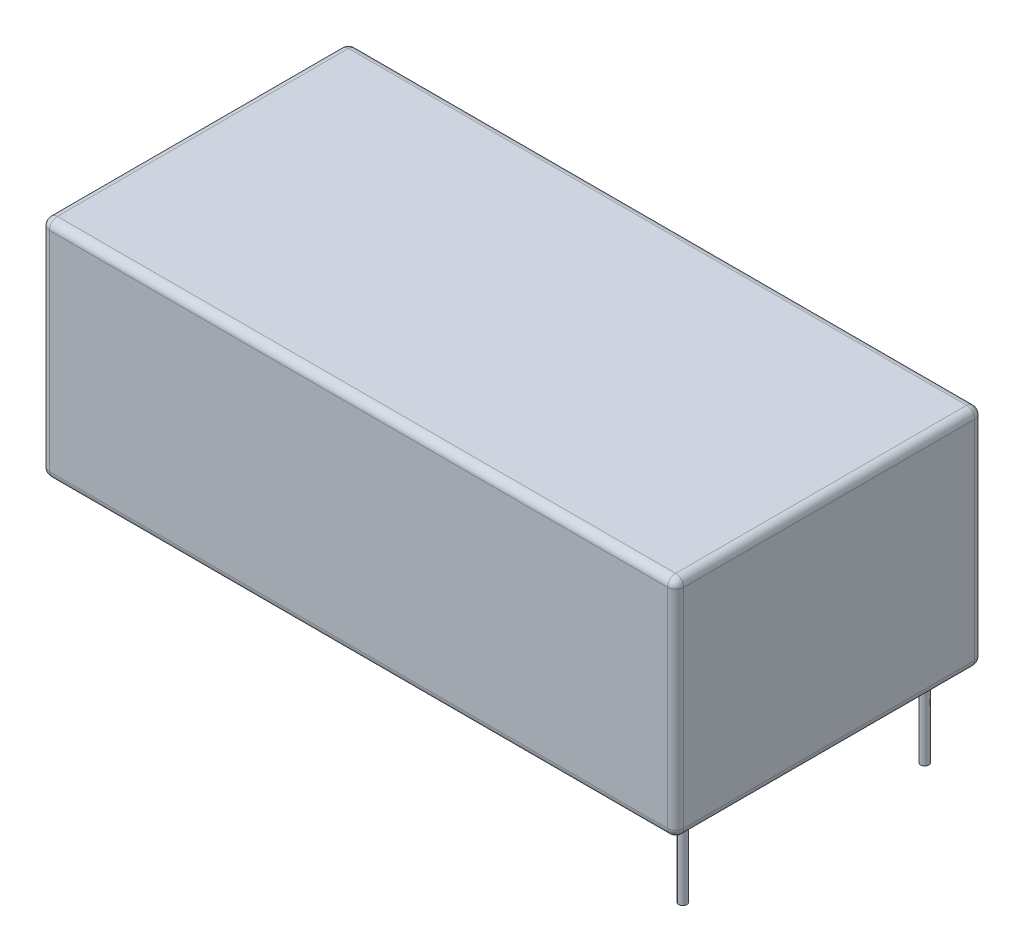
ISO-10303-21;
HEADER;
FILE_DESCRIPTION(('STEP AP214'),'2;1');
FILE_NAME('part.step','',(''),(''),'','','');
FILE_SCHEMA(('AUTOMOTIVE_DESIGN { 1 0 10303 214 1 1 1 1 }'));
ENDSEC;
DATA;
#1=APPLICATION_CONTEXT('core data for automotive mechanical design processes');
#2=APPLICATION_PROTOCOL_DEFINITION('international standard','automotive_design',2000,#1);
#3=PRODUCT_CONTEXT('',#1,'mechanical');
#4=PRODUCT('Part','Part','',(#3));
#5=PRODUCT_RELATED_PRODUCT_CATEGORY('part','',(#4));
#6=PRODUCT_DEFINITION_FORMATION('','',#4);
#7=PRODUCT_DEFINITION_CONTEXT('part definition',#1,'design');
#8=PRODUCT_DEFINITION('design','',#6,#7);
#9=PRODUCT_DEFINITION_SHAPE('','',#8);
#10=(LENGTH_UNIT() NAMED_UNIT(*) SI_UNIT(.MILLI.,.METRE.));
#11=(NAMED_UNIT(*) PLANE_ANGLE_UNIT() SI_UNIT($,.RADIAN.));
#12=(NAMED_UNIT(*) SI_UNIT($,.STERADIAN.) SOLID_ANGLE_UNIT());
#13=UNCERTAINTY_MEASURE_WITH_UNIT(LENGTH_MEASURE(1.E-05),#10,'distance_accuracy_value','');
#14=(GEOMETRIC_REPRESENTATION_CONTEXT(3) GLOBAL_UNCERTAINTY_ASSIGNED_CONTEXT((#13)) GLOBAL_UNIT_ASSIGNED_CONTEXT((#10,
#11,#12)) REPRESENTATION_CONTEXT('',''));
#15=CARTESIAN_POINT('',(0.,0.,0.));
#16=DIRECTION('',(0.,0.,1.));
#17=DIRECTION('',(1.,0.,0.));
#18=AXIS2_PLACEMENT_3D('',#15,#16,#17);
#19=CARTESIAN_POINT('',(0.,0.,38.1));
#20=DIRECTION('',(1.,0.,0.));
#21=DIRECTION('',(0.,0.,-1.));
#22=AXIS2_PLACEMENT_3D('',#19,#20,#21);
#23=PLANE('',#22);
#24=DIRECTION('',(0.,-1.,0.));
#25=VECTOR('',#24,1.);
#26=CARTESIAN_POINT('',(0.,0.,37.1));
#27=LINE('',#26,#25);
#28=CARTESIAN_POINT('',(0.,1.,37.1));
#29=VERTEX_POINT('',#28);
#30=CARTESIAN_POINT('',(0.,26.9,37.1));
#31=VERTEX_POINT('',#30);
#32=EDGE_CURVE('E42',#29,#31,#27,.F.);
#33=ORIENTED_EDGE('',*,*,#32,.T.);
#34=DIRECTION('',(0.,0.,-1.));
#35=VECTOR('',#34,1.);
#36=CARTESIAN_POINT('',(0.,26.9,38.1));
#37=LINE('',#36,#35);
#38=CARTESIAN_POINT('',(0.,26.9,1.));
#39=VERTEX_POINT('',#38);
#40=EDGE_CURVE('E11',#31,#39,#37,.T.);
#41=ORIENTED_EDGE('',*,*,#40,.T.);
#42=DIRECTION('',(0.,-1.,0.));
#43=VECTOR('',#42,1.);
#44=CARTESIAN_POINT('',(0.,0.,1.));
#45=LINE('',#44,#43);
#46=CARTESIAN_POINT('',(0.,1.,1.));
#47=VERTEX_POINT('',#46);
#48=EDGE_CURVE('E202',#39,#47,#45,.T.);
#49=ORIENTED_EDGE('',*,*,#48,.T.);
#50=DIRECTION('',(0.,0.,-1.));
#51=VECTOR('',#50,1.);
#52=CARTESIAN_POINT('',(0.,1.,38.1));
#53=LINE('',#52,#51);
#54=EDGE_CURVE('E53',#47,#29,#53,.F.);
#55=ORIENTED_EDGE('',*,*,#54,.T.);
#56=EDGE_LOOP('',(#33,#41,#49,#55));
#57=FACE_BOUND('',#56,.T.);
#58=ADVANCED_FACE('F33',(#57),#23,.F.);
#59=CARTESIAN_POINT('',(0.,0.,38.1));
#60=DIRECTION('',(0.,1.,0.));
#61=DIRECTION('',(0.,0.,1.));
#62=AXIS2_PLACEMENT_3D('',#59,#60,#61);
#63=PLANE('',#62);
#64=DIRECTION('',(0.,0.,-1.));
#65=VECTOR('',#64,1.);
#66=CARTESIAN_POINT('',(1.,0.,38.1));
#67=LINE('',#66,#65);
#68=CARTESIAN_POINT('',(1.,0.,37.1));
#69=VERTEX_POINT('',#68);
#70=CARTESIAN_POINT('',(1.,0.,1.));
#71=VERTEX_POINT('',#70);
#72=EDGE_CURVE('E126',#69,#71,#67,.T.);
#73=ORIENTED_EDGE('',*,*,#72,.T.);
#74=DIRECTION('',(1.,0.,0.));
#75=VECTOR('',#74,1.);
#76=CARTESIAN_POINT('',(78.7,0.,1.));
#77=LINE('',#76,#75);
#78=CARTESIAN_POINT('',(77.7,0.,1.));
#79=VERTEX_POINT('',#78);
#80=EDGE_CURVE('E165',#71,#79,#77,.T.);
#81=ORIENTED_EDGE('',*,*,#80,.T.);
#82=DIRECTION('',(0.,0.,-1.));
#83=VECTOR('',#82,1.);
#84=CARTESIAN_POINT('',(77.7,0.,38.1));
#85=LINE('',#84,#83);
#86=CARTESIAN_POINT('',(77.7,0.,37.1));
#87=VERTEX_POINT('',#86);
#88=EDGE_CURVE('E129',#79,#87,#85,.F.);
#89=ORIENTED_EDGE('',*,*,#88,.T.);
#90=DIRECTION('',(1.,0.,0.));
#91=VECTOR('',#90,1.);
#92=CARTESIAN_POINT('',(0.,0.,37.1));
#93=LINE('',#92,#91);
#94=EDGE_CURVE('E120',#87,#69,#93,.F.);
#95=ORIENTED_EDGE('',*,*,#94,.T.);
#96=EDGE_LOOP('',(#73,#81,#89,#95));
#97=FACE_BOUND('',#96,.T.);
#98=CARTESIAN_POINT('',(3.2,0.,19.1));
#99=DIRECTION('',(0.,1.,0.));
#100=DIRECTION('',(0.,0.,1.));
#101=AXIS2_PLACEMENT_3D('',#98,#99,#100);
#102=CIRCLE('',#101,0.5);
#103=CARTESIAN_POINT('',(3.2,0.,19.6));
#104=VERTEX_POINT('',#103);
#105=EDGE_CURVE('E157',#104,#104,#102,.F.);
#106=ORIENTED_EDGE('',*,*,#105,.F.);
#107=EDGE_LOOP('',(#106));
#108=FACE_BOUND('',#107,.T.);
#109=CARTESIAN_POINT('',(75.6,0.,34.1));
#110=DIRECTION('',(0.,1.,0.));
#111=DIRECTION('',(0.,0.,1.));
#112=AXIS2_PLACEMENT_3D('',#109,#110,#111);
#113=CIRCLE('',#112,0.499999999999999);
#114=CARTESIAN_POINT('',(75.6,0.,34.6));
#115=VERTEX_POINT('',#114);
#116=EDGE_CURVE('E160',#115,#115,#113,.F.);
#117=ORIENTED_EDGE('',*,*,#116,.F.);
#118=EDGE_LOOP('',(#117));
#119=FACE_BOUND('',#118,.T.);
#120=CARTESIAN_POINT('',(75.6,0.,4.10000000000001));
#121=DIRECTION('',(0.,1.,0.));
#122=DIRECTION('',(0.,0.,1.));
#123=AXIS2_PLACEMENT_3D('',#120,#121,#122);
#124=CIRCLE('',#123,0.499999999999999);
#125=CARTESIAN_POINT('',(75.6,0.,4.60000000000001));
#126=VERTEX_POINT('',#125);
#127=EDGE_CURVE('E281',#126,#126,#124,.F.);
#128=ORIENTED_EDGE('',*,*,#127,.F.);
#129=EDGE_LOOP('',(#128));
#130=FACE_BOUND('',#129,.T.);
#131=CARTESIAN_POINT('',(3.2,0.,4.1));
#132=DIRECTION('',(0.,1.,0.));
#133=DIRECTION('',(0.,0.,1.));
#134=AXIS2_PLACEMENT_3D('',#131,#132,#133);
#135=CIRCLE('',#134,0.500000000000001);
#136=CARTESIAN_POINT('',(3.2,0.,4.6));
#137=VERTEX_POINT('',#136);
#138=EDGE_CURVE('E278',#137,#137,#135,.F.);
#139=ORIENTED_EDGE('',*,*,#138,.F.);
#140=EDGE_LOOP('',(#139));
#141=FACE_BOUND('',#140,.T.);
#142=ADVANCED_FACE('F122',(#97,#108,#119,#130,#141),#63,.F.);
#143=CARTESIAN_POINT('',(78.7,0.,38.1));
#144=DIRECTION('',(-1.,0.,0.));
#145=DIRECTION('',(0.,0.,1.));
#146=AXIS2_PLACEMENT_3D('',#143,#144,#145);
#147=PLANE('',#146);
#148=DIRECTION('',(0.,0.,-1.));
#149=VECTOR('',#148,1.);
#150=CARTESIAN_POINT('',(78.7,1.,38.1));
#151=LINE('',#150,#149);
#152=CARTESIAN_POINT('',(78.7,1.,37.1));
#153=VERTEX_POINT('',#152);
#154=CARTESIAN_POINT('',(78.7,1.,1.));
#155=VERTEX_POINT('',#154);
#156=EDGE_CURVE('E189',#153,#155,#151,.T.);
#157=ORIENTED_EDGE('',*,*,#156,.T.);
#158=DIRECTION('',(0.,1.,0.));
#159=VECTOR('',#158,1.);
#160=CARTESIAN_POINT('',(78.7,27.9,1.));
#161=LINE('',#160,#159);
#162=CARTESIAN_POINT('',(78.7,26.9,1.));
#163=VERTEX_POINT('',#162);
#164=EDGE_CURVE('E192',#155,#163,#161,.T.);
#165=ORIENTED_EDGE('',*,*,#164,.T.);
#166=DIRECTION('',(0.,0.,-1.));
#167=VECTOR('',#166,1.);
#168=CARTESIAN_POINT('',(78.7,26.9,38.1));
#169=LINE('',#168,#167);
#170=CARTESIAN_POINT('',(78.7,26.9,37.1));
#171=VERTEX_POINT('',#170);
#172=EDGE_CURVE('E187',#163,#171,#169,.F.);
#173=ORIENTED_EDGE('',*,*,#172,.T.);
#174=DIRECTION('',(0.,1.,0.));
#175=VECTOR('',#174,1.);
#176=CARTESIAN_POINT('',(78.7,0.,37.1));
#177=LINE('',#176,#175);
#178=EDGE_CURVE('E185',#171,#153,#177,.F.);
#179=ORIENTED_EDGE('',*,*,#178,.T.);
#180=EDGE_LOOP('',(#157,#165,#173,#179));
#181=FACE_BOUND('',#180,.T.);
#182=ADVANCED_FACE('F290',(#181),#147,.F.);
#183=CARTESIAN_POINT('',(0.,27.9,38.1));
#184=DIRECTION('',(0.,-1.,0.));
#185=DIRECTION('',(0.,0.,-1.));
#186=AXIS2_PLACEMENT_3D('',#183,#184,#185);
#187=PLANE('',#186);
#188=DIRECTION('',(0.,0.,-1.));
#189=VECTOR('',#188,1.);
#190=CARTESIAN_POINT('',(77.7,27.9,38.1));
#191=LINE('',#190,#189);
#192=CARTESIAN_POINT('',(77.7,27.9,37.1));
#193=VERTEX_POINT('',#192);
#194=CARTESIAN_POINT('',(77.7,27.9,1.));
#195=VERTEX_POINT('',#194);
#196=EDGE_CURVE('E180',#193,#195,#191,.T.);
#197=ORIENTED_EDGE('',*,*,#196,.T.);
#198=DIRECTION('',(-1.,0.,0.));
#199=VECTOR('',#198,1.);
#200=CARTESIAN_POINT('',(0.,27.9,1.));
#201=LINE('',#200,#199);
#202=CARTESIAN_POINT('',(1.,27.9,1.));
#203=VERTEX_POINT('',#202);
#204=EDGE_CURVE('E182',#195,#203,#201,.T.);
#205=ORIENTED_EDGE('',*,*,#204,.T.);
#206=DIRECTION('',(0.,0.,-1.));
#207=VECTOR('',#206,1.);
#208=CARTESIAN_POINT('',(1.,27.9,38.1));
#209=LINE('',#208,#207);
#210=CARTESIAN_POINT('',(1.,27.9,37.1));
#211=VERTEX_POINT('',#210);
#212=EDGE_CURVE('E176',#203,#211,#209,.F.);
#213=ORIENTED_EDGE('',*,*,#212,.T.);
#214=DIRECTION('',(-1.,0.,0.));
#215=VECTOR('',#214,1.);
#216=CARTESIAN_POINT('',(0.,27.9,37.1));
#217=LINE('',#216,#215);
#218=EDGE_CURVE('E178',#211,#193,#217,.F.);
#219=ORIENTED_EDGE('',*,*,#218,.T.);
#220=EDGE_LOOP('',(#197,#205,#213,#219));
#221=FACE_BOUND('',#220,.T.);
#222=ADVANCED_FACE('F408',(#221),#187,.F.);
#223=CARTESIAN_POINT('',(0.,0.,38.1));
#224=DIRECTION('',(0.,0.,-1.));
#225=DIRECTION('',(-1.,0.,0.));
#226=AXIS2_PLACEMENT_3D('',#223,#224,#225);
#227=PLANE('',#226);
#228=DIRECTION('',(0.,1.,0.));
#229=VECTOR('',#228,1.);
#230=CARTESIAN_POINT('',(77.7,0.,38.1));
#231=LINE('',#230,#229);
#232=CARTESIAN_POINT('',(77.7,1.,38.1));
#233=VERTEX_POINT('',#232);
#234=CARTESIAN_POINT('',(77.7,26.9,38.1));
#235=VERTEX_POINT('',#234);
#236=EDGE_CURVE('E197',#233,#235,#231,.T.);
#237=ORIENTED_EDGE('',*,*,#236,.T.);
#238=DIRECTION('',(-1.,0.,0.));
#239=VECTOR('',#238,1.);
#240=CARTESIAN_POINT('',(0.,26.9,38.1));
#241=LINE('',#240,#239);
#242=CARTESIAN_POINT('',(1.,26.9,38.1));
#243=VERTEX_POINT('',#242);
#244=EDGE_CURVE('E199',#235,#243,#241,.T.);
#245=ORIENTED_EDGE('',*,*,#244,.T.);
#246=DIRECTION('',(0.,-1.,0.));
#247=VECTOR('',#246,1.);
#248=CARTESIAN_POINT('',(1.,0.,38.1));
#249=LINE('',#248,#247);
#250=CARTESIAN_POINT('',(1.,1.,38.1));
#251=VERTEX_POINT('',#250);
#252=EDGE_CURVE('E194',#243,#251,#249,.T.);
#253=ORIENTED_EDGE('',*,*,#252,.T.);
#254=DIRECTION('',(1.,0.,0.));
#255=VECTOR('',#254,1.);
#256=CARTESIAN_POINT('',(0.,1.,38.1));
#257=LINE('',#256,#255);
#258=EDGE_CURVE('E139',#251,#233,#257,.T.);
#259=ORIENTED_EDGE('',*,*,#258,.T.);
#260=EDGE_LOOP('',(#237,#245,#253,#259));
#261=FACE_BOUND('',#260,.T.);
#262=ADVANCED_FACE('F309',(#261),#227,.F.);
#263=CARTESIAN_POINT('',(0.,0.,0.));
#264=DIRECTION('',(0.,0.,-1.));
#265=DIRECTION('',(-1.,0.,0.));
#266=AXIS2_PLACEMENT_3D('',#263,#264,#265);
#267=PLANE('',#266);
#268=DIRECTION('',(-1.,0.,0.));
#269=VECTOR('',#268,1.);
#270=CARTESIAN_POINT('',(78.7,26.9,0.));
#271=LINE('',#270,#269);
#272=CARTESIAN_POINT('',(1.,26.9,0.));
#273=VERTEX_POINT('',#272);
#274=CARTESIAN_POINT('',(77.7,26.9,0.));
#275=VERTEX_POINT('',#274);
#276=EDGE_CURVE('E169',#273,#275,#271,.F.);
#277=ORIENTED_EDGE('',*,*,#276,.T.);
#278=DIRECTION('',(0.,1.,0.));
#279=VECTOR('',#278,1.);
#280=CARTESIAN_POINT('',(77.7,0.,0.));
#281=LINE('',#280,#279);
#282=CARTESIAN_POINT('',(77.7,1.,0.));
#283=VERTEX_POINT('',#282);
#284=EDGE_CURVE('E174',#275,#283,#281,.F.);
#285=ORIENTED_EDGE('',*,*,#284,.T.);
#286=DIRECTION('',(1.,0.,0.));
#287=VECTOR('',#286,1.);
#288=CARTESIAN_POINT('',(0.,1.,0.));
#289=LINE('',#288,#287);
#290=CARTESIAN_POINT('',(1.,1.,0.));
#291=VERTEX_POINT('',#290);
#292=EDGE_CURVE('E171',#283,#291,#289,.F.);
#293=ORIENTED_EDGE('',*,*,#292,.T.);
#294=DIRECTION('',(0.,-1.,0.));
#295=VECTOR('',#294,1.);
#296=CARTESIAN_POINT('',(1.,27.9,0.));
#297=LINE('',#296,#295);
#298=EDGE_CURVE('E167',#291,#273,#297,.F.);
#299=ORIENTED_EDGE('',*,*,#298,.T.);
#300=EDGE_LOOP('',(#277,#285,#293,#299));
#301=FACE_BOUND('',#300,.T.);
#302=ADVANCED_FACE('F299',(#301),#267,.T.);
#303=CARTESIAN_POINT('',(3.2,-10.,4.1));
#304=DIRECTION('',(0.,1.,0.));
#305=DIRECTION('',(0.,0.,1.));
#306=AXIS2_PLACEMENT_3D('',#303,#304,#305);
#307=CYLINDRICAL_SURFACE('',#306,0.500000000000001);
#308=CARTESIAN_POINT('',(3.2,-10.,4.1));
#309=DIRECTION('',(0.,-1.,0.));
#310=DIRECTION('',(0.,0.,-1.));
#311=AXIS2_PLACEMENT_3D('',#308,#309,#310);
#312=CIRCLE('',#311,0.500000000000001);
#313=CARTESIAN_POINT('',(3.2,-10.,3.6));
#314=VERTEX_POINT('',#313);
#315=EDGE_CURVE('E275',#314,#314,#312,.T.);
#316=ORIENTED_EDGE('',*,*,#315,.F.);
#317=EDGE_LOOP('',(#316));
#318=FACE_BOUND('',#317,.T.);
#319=ORIENTED_EDGE('',*,*,#138,.T.);
#320=EDGE_LOOP('',(#319));
#321=FACE_BOUND('',#320,.T.);
#322=ADVANCED_FACE('F296',(#318,#321),#307,.T.);
#323=CARTESIAN_POINT('',(3.2,-10.,4.1));
#324=DIRECTION('',(0.,-1.,0.));
#325=DIRECTION('',(0.,0.,-1.));
#326=AXIS2_PLACEMENT_3D('',#323,#324,#325);
#327=PLANE('',#326);
#328=ORIENTED_EDGE('',*,*,#315,.T.);
#329=EDGE_LOOP('',(#328));
#330=FACE_BOUND('',#329,.T.);
#331=ADVANCED_FACE('F298',(#330),#327,.T.);
#332=CARTESIAN_POINT('',(75.6,-10.,4.10000000000001));
#333=DIRECTION('',(0.,1.,0.));
#334=DIRECTION('',(0.,0.,1.));
#335=AXIS2_PLACEMENT_3D('',#332,#333,#334);
#336=CYLINDRICAL_SURFACE('',#335,0.499999999999999);
#337=CARTESIAN_POINT('',(75.6,-10.,4.10000000000001));
#338=DIRECTION('',(0.,-1.,0.));
#339=DIRECTION('',(0.,0.,-1.));
#340=AXIS2_PLACEMENT_3D('',#337,#338,#339);
#341=CIRCLE('',#340,0.499999999999999);
#342=CARTESIAN_POINT('',(75.6,-10.,3.60000000000001));
#343=VERTEX_POINT('',#342);
#344=EDGE_CURVE('E270',#343,#343,#341,.T.);
#345=ORIENTED_EDGE('',*,*,#344,.F.);
#346=EDGE_LOOP('',(#345));
#347=FACE_BOUND('',#346,.T.);
#348=ORIENTED_EDGE('',*,*,#127,.T.);
#349=EDGE_LOOP('',(#348));
#350=FACE_BOUND('',#349,.T.);
#351=ADVANCED_FACE('F306',(#347,#350),#336,.T.);
#352=CARTESIAN_POINT('',(75.6,-10.,4.10000000000001));
#353=DIRECTION('',(0.,-1.,0.));
#354=DIRECTION('',(0.,0.,-1.));
#355=AXIS2_PLACEMENT_3D('',#352,#353,#354);
#356=PLANE('',#355);
#357=ORIENTED_EDGE('',*,*,#344,.T.);
#358=EDGE_LOOP('',(#357));
#359=FACE_BOUND('',#358,.T.);
#360=ADVANCED_FACE('F477',(#359),#356,.T.);
#361=CARTESIAN_POINT('',(75.6,-10.,34.1));
#362=DIRECTION('',(0.,1.,0.));
#363=DIRECTION('',(0.,0.,1.));
#364=AXIS2_PLACEMENT_3D('',#361,#362,#363);
#365=CYLINDRICAL_SURFACE('',#364,0.499999999999999);
#366=CARTESIAN_POINT('',(75.6,-10.,34.1));
#367=DIRECTION('',(0.,-1.,0.));
#368=DIRECTION('',(0.,0.,-1.));
#369=AXIS2_PLACEMENT_3D('',#366,#367,#368);
#370=CIRCLE('',#369,0.499999999999999);
#371=CARTESIAN_POINT('',(75.6,-10.,33.6));
#372=VERTEX_POINT('',#371);
#373=EDGE_CURVE('E265',#372,#372,#370,.T.);
#374=ORIENTED_EDGE('',*,*,#373,.F.);
#375=EDGE_LOOP('',(#374));
#376=FACE_BOUND('',#375,.T.);
#377=ORIENTED_EDGE('',*,*,#116,.T.);
#378=EDGE_LOOP('',(#377));
#379=FACE_BOUND('',#378,.T.);
#380=ADVANCED_FACE('F286',(#376,#379),#365,.T.);
#381=CARTESIAN_POINT('',(75.6,-10.,34.1));
#382=DIRECTION('',(0.,-1.,0.));
#383=DIRECTION('',(0.,0.,-1.));
#384=AXIS2_PLACEMENT_3D('',#381,#382,#383);
#385=PLANE('',#384);
#386=ORIENTED_EDGE('',*,*,#373,.T.);
#387=EDGE_LOOP('',(#386));
#388=FACE_BOUND('',#387,.T.);
#389=ADVANCED_FACE('F458',(#388),#385,.T.);
#390=CARTESIAN_POINT('',(3.2,-10.,19.1));
#391=DIRECTION('',(0.,1.,0.));
#392=DIRECTION('',(0.,0.,1.));
#393=AXIS2_PLACEMENT_3D('',#390,#391,#392);
#394=CYLINDRICAL_SURFACE('',#393,0.5);
#395=CARTESIAN_POINT('',(3.2,-10.,19.1));
#396=DIRECTION('',(0.,-1.,0.));
#397=DIRECTION('',(0.,0.,-1.));
#398=AXIS2_PLACEMENT_3D('',#395,#396,#397);
#399=CIRCLE('',#398,0.5);
#400=CARTESIAN_POINT('',(3.2,-10.,18.6));
#401=VERTEX_POINT('',#400);
#402=EDGE_CURVE('E259',#401,#401,#399,.T.);
#403=ORIENTED_EDGE('',*,*,#402,.F.);
#404=EDGE_LOOP('',(#403));
#405=FACE_BOUND('',#404,.T.);
#406=ORIENTED_EDGE('',*,*,#105,.T.);
#407=EDGE_LOOP('',(#406));
#408=FACE_BOUND('',#407,.T.);
#409=ADVANCED_FACE('F448',(#405,#408),#394,.T.);
#410=CARTESIAN_POINT('',(3.2,-10.,19.1));
#411=DIRECTION('',(0.,-1.,0.));
#412=DIRECTION('',(0.,0.,-1.));
#413=AXIS2_PLACEMENT_3D('',#410,#411,#412);
#414=PLANE('',#413);
#415=ORIENTED_EDGE('',*,*,#402,.T.);
#416=EDGE_LOOP('',(#415));
#417=FACE_BOUND('',#416,.T.);
#418=ADVANCED_FACE('F389',(#417),#414,.T.);
#419=CARTESIAN_POINT('',(0.,26.9,37.1));
#420=DIRECTION('',(-1.,0.,0.));
#421=DIRECTION('',(0.,0.,1.));
#422=AXIS2_PLACEMENT_3D('',#419,#420,#421);
#423=CYLINDRICAL_SURFACE('',#422,1.);
#424=CARTESIAN_POINT('',(1.,26.9,37.1));
#425=DIRECTION('',(-1.,0.,0.));
#426=DIRECTION('',(0.,0.,1.));
#427=AXIS2_PLACEMENT_3D('',#424,#425,#426);
#428=CIRCLE('',#427,1.);
#429=EDGE_CURVE('E37',#243,#211,#428,.T.);
#430=ORIENTED_EDGE('',*,*,#429,.F.);
#431=ORIENTED_EDGE('',*,*,#244,.F.);
#432=CARTESIAN_POINT('',(77.7,26.9,37.1));
#433=DIRECTION('',(1.,0.,0.));
#434=DIRECTION('',(0.,0.,-1.));
#435=AXIS2_PLACEMENT_3D('',#432,#433,#434);
#436=CIRCLE('',#435,1.);
#437=EDGE_CURVE('E252',#193,#235,#436,.T.);
#438=ORIENTED_EDGE('',*,*,#437,.F.);
#439=ORIENTED_EDGE('',*,*,#218,.F.);
#440=EDGE_LOOP('',(#430,#431,#438,#439));
#441=FACE_BOUND('',#440,.T.);
#442=ADVANCED_FACE('F35',(#441),#423,.T.);
#443=CARTESIAN_POINT('',(1.,26.9,37.1));
#444=DIRECTION('',(0.,0.,1.));
#445=DIRECTION('',(1.,0.,0.));
#446=AXIS2_PLACEMENT_3D('',#443,#444,#445);
#447=SPHERICAL_SURFACE('',#446,1.);
#448=CARTESIAN_POINT('',(1.,26.9,37.1));
#449=DIRECTION('',(0.,1.,0.));
#450=DIRECTION('',(0.,0.,1.));
#451=AXIS2_PLACEMENT_3D('',#448,#449,#450);
#452=CIRCLE('',#451,1.);
#453=EDGE_CURVE('E248',#243,#31,#452,.F.);
#454=ORIENTED_EDGE('',*,*,#453,.F.);
#455=ORIENTED_EDGE('',*,*,#429,.T.);
#456=CARTESIAN_POINT('',(1.,26.9,37.1));
#457=DIRECTION('',(0.,0.,1.));
#458=DIRECTION('',(1.,0.,0.));
#459=AXIS2_PLACEMENT_3D('',#456,#457,#458);
#460=CIRCLE('',#459,1.);
#461=EDGE_CURVE('E250',#31,#211,#460,.F.);
#462=ORIENTED_EDGE('',*,*,#461,.F.);
#463=EDGE_LOOP('',(#454,#455,#462));
#464=FACE_BOUND('',#463,.T.);
#465=ADVANCED_FACE('F384',(#464),#447,.T.);
#466=CARTESIAN_POINT('',(77.7,26.9,37.1));
#467=DIRECTION('',(0.,0.,1.));
#468=DIRECTION('',(1.,0.,0.));
#469=AXIS2_PLACEMENT_3D('',#466,#467,#468);
#470=SPHERICAL_SURFACE('',#469,1.);
#471=CARTESIAN_POINT('',(77.7,26.9,37.1));
#472=DIRECTION('',(0.,0.,1.));
#473=DIRECTION('',(1.,0.,0.));
#474=AXIS2_PLACEMENT_3D('',#471,#472,#473);
#475=CIRCLE('',#474,1.);
#476=EDGE_CURVE('E242',#193,#171,#475,.F.);
#477=ORIENTED_EDGE('',*,*,#476,.F.);
#478=ORIENTED_EDGE('',*,*,#437,.T.);
#479=CARTESIAN_POINT('',(77.7,26.9,37.1));
#480=DIRECTION('',(0.,1.,0.));
#481=DIRECTION('',(0.,0.,1.));
#482=AXIS2_PLACEMENT_3D('',#479,#480,#481);
#483=CIRCLE('',#482,1.);
#484=EDGE_CURVE('E245',#171,#235,#483,.F.);
#485=ORIENTED_EDGE('',*,*,#484,.F.);
#486=EDGE_LOOP('',(#477,#478,#485));
#487=FACE_BOUND('',#486,.T.);
#488=ADVANCED_FACE('F381',(#487),#470,.T.);
#489=CARTESIAN_POINT('',(1.,26.9,38.1));
#490=DIRECTION('',(0.,0.,-1.));
#491=DIRECTION('',(-1.,0.,0.));
#492=AXIS2_PLACEMENT_3D('',#489,#490,#491);
#493=CYLINDRICAL_SURFACE('',#492,1.);
#494=ORIENTED_EDGE('',*,*,#461,.T.);
#495=ORIENTED_EDGE('',*,*,#212,.F.);
#496=CARTESIAN_POINT('',(1.,26.9,1.));
#497=DIRECTION('',(0.,0.,-1.));
#498=DIRECTION('',(-1.,0.,0.));
#499=AXIS2_PLACEMENT_3D('',#496,#497,#498);
#500=CIRCLE('',#499,1.);
#501=EDGE_CURVE('E237',#39,#203,#500,.T.);
#502=ORIENTED_EDGE('',*,*,#501,.F.);
#503=ORIENTED_EDGE('',*,*,#40,.F.);
#504=EDGE_LOOP('',(#494,#495,#502,#503));
#505=FACE_BOUND('',#504,.T.);
#506=ADVANCED_FACE('F377',(#505),#493,.T.);
#507=CARTESIAN_POINT('',(1.,0.,37.1));
#508=DIRECTION('',(0.,-1.,0.));
#509=DIRECTION('',(0.,0.,-1.));
#510=AXIS2_PLACEMENT_3D('',#507,#508,#509);
#511=CYLINDRICAL_SURFACE('',#510,1.);
#512=ORIENTED_EDGE('',*,*,#453,.T.);
#513=ORIENTED_EDGE('',*,*,#32,.F.);
#514=CARTESIAN_POINT('',(1.,1.,37.1));
#515=DIRECTION('',(0.,-1.,0.));
#516=DIRECTION('',(0.,0.,-1.));
#517=AXIS2_PLACEMENT_3D('',#514,#515,#516);
#518=CIRCLE('',#517,1.);
#519=EDGE_CURVE('E143',#251,#29,#518,.T.);
#520=ORIENTED_EDGE('',*,*,#519,.F.);
#521=ORIENTED_EDGE('',*,*,#252,.F.);
#522=EDGE_LOOP('',(#512,#513,#520,#521));
#523=FACE_BOUND('',#522,.T.);
#524=ADVANCED_FACE('F374',(#523),#511,.T.);
#525=CARTESIAN_POINT('',(0.,1.,37.1));
#526=DIRECTION('',(1.,0.,0.));
#527=DIRECTION('',(0.,0.,-1.));
#528=AXIS2_PLACEMENT_3D('',#525,#526,#527);
#529=CYLINDRICAL_SURFACE('',#528,1.);
#530=CARTESIAN_POINT('',(77.7,1.,37.1));
#531=DIRECTION('',(1.,0.,0.));
#532=DIRECTION('',(0.,0.,-1.));
#533=AXIS2_PLACEMENT_3D('',#530,#531,#532);
#534=CIRCLE('',#533,1.);
#535=EDGE_CURVE('E144',#233,#87,#534,.T.);
#536=ORIENTED_EDGE('',*,*,#535,.F.);
#537=ORIENTED_EDGE('',*,*,#258,.F.);
#538=CARTESIAN_POINT('',(1.,1.,37.1));
#539=DIRECTION('',(-1.,0.,0.));
#540=DIRECTION('',(0.,0.,1.));
#541=AXIS2_PLACEMENT_3D('',#538,#539,#540);
#542=CIRCLE('',#541,1.);
#543=EDGE_CURVE('E136',#69,#251,#542,.T.);
#544=ORIENTED_EDGE('',*,*,#543,.F.);
#545=ORIENTED_EDGE('',*,*,#94,.F.);
#546=EDGE_LOOP('',(#536,#537,#544,#545));
#547=FACE_BOUND('',#546,.T.);
#548=ADVANCED_FACE('F138',(#547),#529,.T.);
#549=CARTESIAN_POINT('',(77.7,0.,37.1));
#550=DIRECTION('',(0.,1.,0.));
#551=DIRECTION('',(0.,0.,1.));
#552=AXIS2_PLACEMENT_3D('',#549,#550,#551);
#553=CYLINDRICAL_SURFACE('',#552,1.);
#554=ORIENTED_EDGE('',*,*,#484,.T.);
#555=ORIENTED_EDGE('',*,*,#236,.F.);
#556=CARTESIAN_POINT('',(77.7,1.,37.1));
#557=DIRECTION('',(0.,-1.,0.));
#558=DIRECTION('',(0.,0.,-1.));
#559=AXIS2_PLACEMENT_3D('',#556,#557,#558);
#560=CIRCLE('',#559,1.);
#561=EDGE_CURVE('E232',#153,#233,#560,.T.);
#562=ORIENTED_EDGE('',*,*,#561,.F.);
#563=ORIENTED_EDGE('',*,*,#178,.F.);
#564=EDGE_LOOP('',(#554,#555,#562,#563));
#565=FACE_BOUND('',#564,.T.);
#566=ADVANCED_FACE('F367',(#565),#553,.T.);
#567=CARTESIAN_POINT('',(77.7,26.9,38.1));
#568=DIRECTION('',(0.,0.,-1.));
#569=DIRECTION('',(-1.,0.,0.));
#570=AXIS2_PLACEMENT_3D('',#567,#568,#569);
#571=CYLINDRICAL_SURFACE('',#570,1.);
#572=ORIENTED_EDGE('',*,*,#476,.T.);
#573=ORIENTED_EDGE('',*,*,#172,.F.);
#574=CARTESIAN_POINT('',(77.7,26.9,1.));
#575=DIRECTION('',(0.,0.,-1.));
#576=DIRECTION('',(-1.,0.,0.));
#577=AXIS2_PLACEMENT_3D('',#574,#575,#576);
#578=CIRCLE('',#577,1.);
#579=EDGE_CURVE('E229',#195,#163,#578,.T.);
#580=ORIENTED_EDGE('',*,*,#579,.F.);
#581=ORIENTED_EDGE('',*,*,#196,.F.);
#582=EDGE_LOOP('',(#572,#573,#580,#581));
#583=FACE_BOUND('',#582,.T.);
#584=ADVANCED_FACE('F363',(#583),#571,.T.);
#585=CARTESIAN_POINT('',(0.,26.9,1.));
#586=DIRECTION('',(1.,0.,0.));
#587=DIRECTION('',(0.,0.,-1.));
#588=AXIS2_PLACEMENT_3D('',#585,#586,#587);
#589=CYLINDRICAL_SURFACE('',#588,1.);
#590=CARTESIAN_POINT('',(1.,26.9,1.));
#591=DIRECTION('',(-1.,0.,0.));
#592=DIRECTION('',(0.,0.,1.));
#593=AXIS2_PLACEMENT_3D('',#590,#591,#592);
#594=CIRCLE('',#593,1.);
#595=EDGE_CURVE('E239',#203,#273,#594,.T.);
#596=ORIENTED_EDGE('',*,*,#595,.F.);
#597=ORIENTED_EDGE('',*,*,#204,.F.);
#598=CARTESIAN_POINT('',(77.7,26.9,1.));
#599=DIRECTION('',(1.,0.,0.));
#600=DIRECTION('',(0.,1.,0.));
#601=AXIS2_PLACEMENT_3D('',#598,#599,#600);
#602=CIRCLE('',#601,1.);
#603=EDGE_CURVE('E226',#275,#195,#602,.T.);
#604=ORIENTED_EDGE('',*,*,#603,.F.);
#605=ORIENTED_EDGE('',*,*,#276,.F.);
#606=EDGE_LOOP('',(#596,#597,#604,#605));
#607=FACE_BOUND('',#606,.T.);
#608=ADVANCED_FACE('F359',(#607),#589,.T.);
#609=CARTESIAN_POINT('',(1.,26.9,1.));
#610=DIRECTION('',(0.,0.,1.));
#611=DIRECTION('',(1.,0.,0.));
#612=AXIS2_PLACEMENT_3D('',#609,#610,#611);
#613=SPHERICAL_SURFACE('',#612,1.);
#614=ORIENTED_EDGE('',*,*,#501,.T.);
#615=ORIENTED_EDGE('',*,*,#595,.T.);
#616=CARTESIAN_POINT('',(1.,26.9,1.));
#617=DIRECTION('',(0.,1.,0.));
#618=DIRECTION('',(0.,0.,1.));
#619=AXIS2_PLACEMENT_3D('',#616,#617,#618);
#620=CIRCLE('',#619,1.);
#621=EDGE_CURVE('E150',#39,#273,#620,.F.);
#622=ORIENTED_EDGE('',*,*,#621,.F.);
#623=EDGE_LOOP('',(#614,#615,#622));
#624=FACE_BOUND('',#623,.T.);
#625=ADVANCED_FACE('F356',(#624),#613,.T.);
#626=CARTESIAN_POINT('',(1.,1.,37.1));
#627=DIRECTION('',(0.,0.,1.));
#628=DIRECTION('',(1.,0.,0.));
#629=AXIS2_PLACEMENT_3D('',#626,#627,#628);
#630=SPHERICAL_SURFACE('',#629,1.);
#631=ORIENTED_EDGE('',*,*,#543,.T.);
#632=ORIENTED_EDGE('',*,*,#519,.T.);
#633=CARTESIAN_POINT('',(1.,1.,37.1));
#634=DIRECTION('',(0.,0.,1.));
#635=DIRECTION('',(1.,0.,0.));
#636=AXIS2_PLACEMENT_3D('',#633,#634,#635);
#637=CIRCLE('',#636,1.);
#638=EDGE_CURVE('E147',#69,#29,#637,.F.);
#639=ORIENTED_EDGE('',*,*,#638,.F.);
#640=EDGE_LOOP('',(#631,#632,#639));
#641=FACE_BOUND('',#640,.T.);
#642=ADVANCED_FACE('F148',(#641),#630,.T.);
#643=CARTESIAN_POINT('',(77.7,1.,37.1));
#644=DIRECTION('',(0.,0.,1.));
#645=DIRECTION('',(1.,0.,0.));
#646=AXIS2_PLACEMENT_3D('',#643,#644,#645);
#647=SPHERICAL_SURFACE('',#646,1.);
#648=ORIENTED_EDGE('',*,*,#561,.T.);
#649=ORIENTED_EDGE('',*,*,#535,.T.);
#650=CARTESIAN_POINT('',(77.7,1.,37.1));
#651=DIRECTION('',(0.,0.,1.));
#652=DIRECTION('',(1.,0.,0.));
#653=AXIS2_PLACEMENT_3D('',#650,#651,#652);
#654=CIRCLE('',#653,1.);
#655=EDGE_CURVE('E151',#153,#87,#654,.F.);
#656=ORIENTED_EDGE('',*,*,#655,.F.);
#657=EDGE_LOOP('',(#648,#649,#656));
#658=FACE_BOUND('',#657,.T.);
#659=ADVANCED_FACE('F349',(#658),#647,.T.);
#660=CARTESIAN_POINT('',(77.7,26.9,1.));
#661=DIRECTION('',(0.,0.,1.));
#662=DIRECTION('',(1.,0.,0.));
#663=AXIS2_PLACEMENT_3D('',#660,#661,#662);
#664=SPHERICAL_SURFACE('',#663,1.);
#665=ORIENTED_EDGE('',*,*,#603,.T.);
#666=ORIENTED_EDGE('',*,*,#579,.T.);
#667=CARTESIAN_POINT('',(77.7,26.9,1.));
#668=DIRECTION('',(0.,1.,0.));
#669=DIRECTION('',(0.,0.,1.));
#670=AXIS2_PLACEMENT_3D('',#667,#668,#669);
#671=CIRCLE('',#670,1.);
#672=EDGE_CURVE('E219',#275,#163,#671,.F.);
#673=ORIENTED_EDGE('',*,*,#672,.F.);
#674=EDGE_LOOP('',(#665,#666,#673));
#675=FACE_BOUND('',#674,.T.);
#676=ADVANCED_FACE('F345',(#675),#664,.T.);
#677=CARTESIAN_POINT('',(1.,0.,1.));
#678=DIRECTION('',(0.,1.,0.));
#679=DIRECTION('',(0.,0.,1.));
#680=AXIS2_PLACEMENT_3D('',#677,#678,#679);
#681=CYLINDRICAL_SURFACE('',#680,1.);
#682=ORIENTED_EDGE('',*,*,#621,.T.);
#683=ORIENTED_EDGE('',*,*,#298,.F.);
#684=CARTESIAN_POINT('',(1.,1.,1.));
#685=DIRECTION('',(0.,-1.,0.));
#686=DIRECTION('',(0.,0.,-1.));
#687=AXIS2_PLACEMENT_3D('',#684,#685,#686);
#688=CIRCLE('',#687,1.);
#689=EDGE_CURVE('E216',#47,#291,#688,.T.);
#690=ORIENTED_EDGE('',*,*,#689,.F.);
#691=ORIENTED_EDGE('',*,*,#48,.F.);
#692=EDGE_LOOP('',(#682,#683,#690,#691));
#693=FACE_BOUND('',#692,.T.);
#694=ADVANCED_FACE('F342',(#693),#681,.T.);
#695=CARTESIAN_POINT('',(1.,1.,38.1));
#696=DIRECTION('',(0.,0.,-1.));
#697=DIRECTION('',(-1.,0.,0.));
#698=AXIS2_PLACEMENT_3D('',#695,#696,#697);
#699=CYLINDRICAL_SURFACE('',#698,1.);
#700=ORIENTED_EDGE('',*,*,#638,.T.);
#701=ORIENTED_EDGE('',*,*,#54,.F.);
#702=CARTESIAN_POINT('',(1.,1.,1.));
#703=DIRECTION('',(0.,0.,-1.));
#704=DIRECTION('',(-1.,0.,0.));
#705=AXIS2_PLACEMENT_3D('',#702,#703,#704);
#706=CIRCLE('',#705,1.);
#707=EDGE_CURVE('E155',#71,#47,#706,.T.);
#708=ORIENTED_EDGE('',*,*,#707,.F.);
#709=ORIENTED_EDGE('',*,*,#72,.F.);
#710=EDGE_LOOP('',(#700,#701,#708,#709));
#711=FACE_BOUND('',#710,.T.);
#712=ADVANCED_FACE('F153',(#711),#699,.T.);
#713=CARTESIAN_POINT('',(77.7,1.,38.1));
#714=DIRECTION('',(0.,0.,-1.));
#715=DIRECTION('',(-1.,0.,0.));
#716=AXIS2_PLACEMENT_3D('',#713,#714,#715);
#717=CYLINDRICAL_SURFACE('',#716,1.);
#718=ORIENTED_EDGE('',*,*,#655,.T.);
#719=ORIENTED_EDGE('',*,*,#88,.F.);
#720=CARTESIAN_POINT('',(77.7,1.,1.));
#721=DIRECTION('',(0.,0.,-1.));
#722=DIRECTION('',(-1.,0.,0.));
#723=AXIS2_PLACEMENT_3D('',#720,#721,#722);
#724=CIRCLE('',#723,1.);
#725=EDGE_CURVE('E212',#155,#79,#724,.T.);
#726=ORIENTED_EDGE('',*,*,#725,.F.);
#727=ORIENTED_EDGE('',*,*,#156,.F.);
#728=EDGE_LOOP('',(#718,#719,#726,#727));
#729=FACE_BOUND('',#728,.T.);
#730=ADVANCED_FACE('F335',(#729),#717,.T.);
#731=CARTESIAN_POINT('',(77.7,0.,1.));
#732=DIRECTION('',(0.,-1.,0.));
#733=DIRECTION('',(0.,0.,-1.));
#734=AXIS2_PLACEMENT_3D('',#731,#732,#733);
#735=CYLINDRICAL_SURFACE('',#734,1.);
#736=ORIENTED_EDGE('',*,*,#672,.T.);
#737=ORIENTED_EDGE('',*,*,#164,.F.);
#738=CARTESIAN_POINT('',(77.7,1.,1.));
#739=DIRECTION('',(0.,-1.,0.));
#740=DIRECTION('',(1.,0.,0.));
#741=AXIS2_PLACEMENT_3D('',#738,#739,#740);
#742=CIRCLE('',#741,1.);
#743=EDGE_CURVE('E210',#283,#155,#742,.T.);
#744=ORIENTED_EDGE('',*,*,#743,.F.);
#745=ORIENTED_EDGE('',*,*,#284,.F.);
#746=EDGE_LOOP('',(#736,#737,#744,#745));
#747=FACE_BOUND('',#746,.T.);
#748=ADVANCED_FACE('F331',(#747),#735,.T.);
#749=CARTESIAN_POINT('',(1.,1.,1.));
#750=DIRECTION('',(0.,0.,1.));
#751=DIRECTION('',(1.,0.,0.));
#752=AXIS2_PLACEMENT_3D('',#749,#750,#751);
#753=SPHERICAL_SURFACE('',#752,1.);
#754=ORIENTED_EDGE('',*,*,#707,.T.);
#755=ORIENTED_EDGE('',*,*,#689,.T.);
#756=CARTESIAN_POINT('',(1.,1.,1.));
#757=DIRECTION('',(-1.,0.,0.));
#758=DIRECTION('',(0.,-1.,0.));
#759=AXIS2_PLACEMENT_3D('',#756,#757,#758);
#760=CIRCLE('',#759,1.);
#761=EDGE_CURVE('E208',#71,#291,#760,.F.);
#762=ORIENTED_EDGE('',*,*,#761,.F.);
#763=EDGE_LOOP('',(#754,#755,#762));
#764=FACE_BOUND('',#763,.T.);
#765=ADVANCED_FACE('F327',(#764),#753,.T.);
#766=CARTESIAN_POINT('',(77.7,1.,1.));
#767=DIRECTION('',(0.,0.,1.));
#768=DIRECTION('',(1.,0.,0.));
#769=AXIS2_PLACEMENT_3D('',#766,#767,#768);
#770=SPHERICAL_SURFACE('',#769,1.);
#771=ORIENTED_EDGE('',*,*,#743,.T.);
#772=ORIENTED_EDGE('',*,*,#725,.T.);
#773=CARTESIAN_POINT('',(77.7,1.,1.));
#774=DIRECTION('',(1.,0.,0.));
#775=DIRECTION('',(0.,0.,-1.));
#776=AXIS2_PLACEMENT_3D('',#773,#774,#775);
#777=CIRCLE('',#776,1.);
#778=EDGE_CURVE('E206',#283,#79,#777,.F.);
#779=ORIENTED_EDGE('',*,*,#778,.F.);
#780=EDGE_LOOP('',(#771,#772,#779));
#781=FACE_BOUND('',#780,.T.);
#782=ADVANCED_FACE('F323',(#781),#770,.T.);
#783=CARTESIAN_POINT('',(0.,1.,1.));
#784=DIRECTION('',(-1.,0.,0.));
#785=DIRECTION('',(0.,0.,1.));
#786=AXIS2_PLACEMENT_3D('',#783,#784,#785);
#787=CYLINDRICAL_SURFACE('',#786,1.);
#788=ORIENTED_EDGE('',*,*,#761,.T.);
#789=ORIENTED_EDGE('',*,*,#292,.F.);
#790=ORIENTED_EDGE('',*,*,#778,.T.);
#791=ORIENTED_EDGE('',*,*,#80,.F.);
#792=EDGE_LOOP('',(#788,#789,#790,#791));
#793=FACE_BOUND('',#792,.T.);
#794=ADVANCED_FACE('F320',(#793),#787,.T.);
#795=CLOSED_SHELL('',(#58,#142,#182,#222,#262,#302,#322,#331,#351,#360,#380,#389,#409,#418,#442,
#465,#488,#506,#524,#548,#566,#584,#608,#625,#642,#659,#676,#694,#712,#730,#748,#765,#782,#794));
#796=MANIFOLD_SOLID_BREP('B2',#795);
#797=ADVANCED_BREP_SHAPE_REPRESENTATION('',(#18,#796),#14);
#798=SHAPE_DEFINITION_REPRESENTATION(#9,#797);
ENDSEC;
END-ISO-10303-21;
